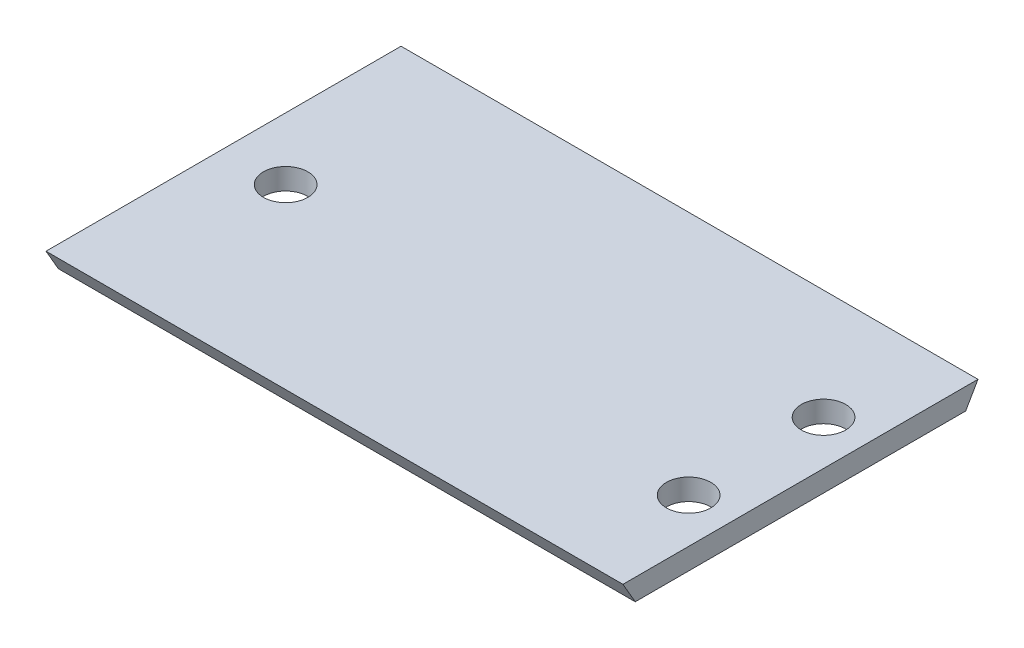
ISO-10303-21;
HEADER;
FILE_DESCRIPTION(('STEP AP214'),'2;1');
FILE_NAME('part.step','',(''),(''),'','','');
FILE_SCHEMA(('AUTOMOTIVE_DESIGN { 1 0 10303 214 1 1 1 1 }'));
ENDSEC;
DATA;
#1=APPLICATION_CONTEXT('core data for automotive mechanical design processes');
#2=APPLICATION_PROTOCOL_DEFINITION('international standard','automotive_design',2000,#1);
#3=PRODUCT_CONTEXT('',#1,'mechanical');
#4=PRODUCT('Part','Part','',(#3));
#5=PRODUCT_RELATED_PRODUCT_CATEGORY('part','',(#4));
#6=PRODUCT_DEFINITION_FORMATION('','',#4);
#7=PRODUCT_DEFINITION_CONTEXT('part definition',#1,'design');
#8=PRODUCT_DEFINITION('design','',#6,#7);
#9=PRODUCT_DEFINITION_SHAPE('','',#8);
#10=(LENGTH_UNIT() NAMED_UNIT(*) SI_UNIT(.MILLI.,.METRE.));
#11=(NAMED_UNIT(*) PLANE_ANGLE_UNIT() SI_UNIT($,.RADIAN.));
#12=(NAMED_UNIT(*) SI_UNIT($,.STERADIAN.) SOLID_ANGLE_UNIT());
#13=UNCERTAINTY_MEASURE_WITH_UNIT(LENGTH_MEASURE(1.E-05),#10,'distance_accuracy_value','');
#14=(GEOMETRIC_REPRESENTATION_CONTEXT(3) GLOBAL_UNCERTAINTY_ASSIGNED_CONTEXT((#13)) GLOBAL_UNIT_ASSIGNED_CONTEXT((#10,
#11,#12)) REPRESENTATION_CONTEXT('',''));
#15=CARTESIAN_POINT('',(0.,0.,0.));
#16=DIRECTION('',(0.,0.,1.));
#17=DIRECTION('',(1.,0.,0.));
#18=AXIS2_PLACEMENT_3D('',#15,#16,#17);
#19=CARTESIAN_POINT('',(0.,-1.2,0.));
#20=DIRECTION('',(-1.,0.,0.));
#21=DIRECTION('',(0.,0.,1.));
#22=AXIS2_PLACEMENT_3D('',#19,#20,#21);
#23=PLANE('',#22);
#24=DIRECTION('',(0.,0.,1.));
#25=VECTOR('',#24,1.);
#26=CARTESIAN_POINT('',(0.,-1.2,0.));
#27=LINE('',#26,#25);
#28=CARTESIAN_POINT('',(0.,-1.2,-19.3071796769724));
#29=VERTEX_POINT('',#28);
#30=CARTESIAN_POINT('',(0.,-1.2,-0.692820323027553));
#31=VERTEX_POINT('',#30);
#32=EDGE_CURVE('E80',#29,#31,#27,.T.);
#33=ORIENTED_EDGE('',*,*,#32,.T.);
#34=DIRECTION('',(0.,0.866025403784439,0.499999999999999));
#35=VECTOR('',#34,1.);
#36=CARTESIAN_POINT('',(0.,-0.899999999999999,-0.519615242270665));
#37=LINE('',#36,#35);
#38=CARTESIAN_POINT('',(0.,0.,0.));
#39=VERTEX_POINT('',#38);
#40=EDGE_CURVE('E11',#31,#39,#37,.T.);
#41=ORIENTED_EDGE('',*,*,#40,.T.);
#42=DIRECTION('',(0.,0.,1.));
#43=VECTOR('',#42,1.);
#44=CARTESIAN_POINT('',(0.,0.,0.));
#45=LINE('',#44,#43);
#46=CARTESIAN_POINT('',(0.,0.,-20.));
#47=VERTEX_POINT('',#46);
#48=EDGE_CURVE('E78',#47,#39,#45,.T.);
#49=ORIENTED_EDGE('',*,*,#48,.F.);
#50=DIRECTION('',(0.,-0.866025403784439,0.499999999999999));
#51=VECTOR('',#50,1.);
#52=CARTESIAN_POINT('',(0.,-9.56025403784437,-14.4803847577293));
#53=LINE('',#52,#51);
#54=EDGE_CURVE('E107',#47,#29,#53,.T.);
#55=ORIENTED_EDGE('',*,*,#54,.T.);
#56=EDGE_LOOP('',(#33,#41,#49,#55));
#57=FACE_BOUND('',#56,.T.);
#58=ADVANCED_FACE('F37',(#57),#23,.T.);
#59=CARTESIAN_POINT('',(32.5,-1.2,0.));
#60=DIRECTION('',(1.,0.,0.));
#61=DIRECTION('',(0.,0.,-1.));
#62=AXIS2_PLACEMENT_3D('',#59,#60,#61);
#63=PLANE('',#62);
#64=DIRECTION('',(0.,0.,-1.));
#65=VECTOR('',#64,1.);
#66=CARTESIAN_POINT('',(32.5,0.,0.));
#67=LINE('',#66,#65);
#68=CARTESIAN_POINT('',(32.5,0.,0.));
#69=VERTEX_POINT('',#68);
#70=CARTESIAN_POINT('',(32.5,0.,-20.));
#71=VERTEX_POINT('',#70);
#72=EDGE_CURVE('E92',#69,#71,#67,.T.);
#73=ORIENTED_EDGE('',*,*,#72,.F.);
#74=DIRECTION('',(0.,-0.866025403784439,-0.499999999999999));
#75=VECTOR('',#74,1.);
#76=CARTESIAN_POINT('',(32.5,-0.900000000000004,-0.519615242270668));
#77=LINE('',#76,#75);
#78=CARTESIAN_POINT('',(32.5,-1.2,-0.692820323027553));
#79=VERTEX_POINT('',#78);
#80=EDGE_CURVE('E59',#69,#79,#77,.T.);
#81=ORIENTED_EDGE('',*,*,#80,.T.);
#82=DIRECTION('',(0.,0.,-1.));
#83=VECTOR('',#82,1.);
#84=CARTESIAN_POINT('',(32.5,-1.2,0.));
#85=LINE('',#84,#83);
#86=CARTESIAN_POINT('',(32.5,-1.2,-19.3071796769724));
#87=VERTEX_POINT('',#86);
#88=EDGE_CURVE('E117',#79,#87,#85,.T.);
#89=ORIENTED_EDGE('',*,*,#88,.T.);
#90=DIRECTION('',(0.,0.866025403784439,-0.499999999999999));
#91=VECTOR('',#90,1.);
#92=CARTESIAN_POINT('',(32.5,-9.56025403784437,-14.4803847577294));
#93=LINE('',#92,#91);
#94=EDGE_CURVE('E113',#87,#71,#93,.T.);
#95=ORIENTED_EDGE('',*,*,#94,.T.);
#96=EDGE_LOOP('',(#73,#81,#89,#95));
#97=FACE_BOUND('',#96,.T.);
#98=ADVANCED_FACE('F116',(#97),#63,.T.);
#99=CARTESIAN_POINT('',(30.,-1.2,-13.8));
#100=DIRECTION('',(0.,1.,0.));
#101=DIRECTION('',(0.,0.,1.));
#102=AXIS2_PLACEMENT_3D('',#99,#100,#101);
#103=CYLINDRICAL_SURFACE('',#102,1.25);
#104=CARTESIAN_POINT('',(30.,-1.2,-13.8));
#105=DIRECTION('',(0.,1.,0.));
#106=DIRECTION('',(0.,0.,1.));
#107=AXIS2_PLACEMENT_3D('',#104,#105,#106);
#108=CIRCLE('',#107,1.25);
#109=CARTESIAN_POINT('',(30.,-1.2,-12.55));
#110=VERTEX_POINT('',#109);
#111=EDGE_CURVE('E129',#110,#110,#108,.T.);
#112=ORIENTED_EDGE('',*,*,#111,.F.);
#113=EDGE_LOOP('',(#112));
#114=FACE_BOUND('',#113,.T.);
#115=CARTESIAN_POINT('',(30.,0.,-13.8));
#116=DIRECTION('',(0.,1.,0.));
#117=DIRECTION('',(0.,0.,1.));
#118=AXIS2_PLACEMENT_3D('',#115,#116,#117);
#119=CIRCLE('',#118,1.25);
#120=CARTESIAN_POINT('',(30.,0.,-12.55));
#121=VERTEX_POINT('',#120);
#122=EDGE_CURVE('E101',#121,#121,#119,.T.);
#123=ORIENTED_EDGE('',*,*,#122,.T.);
#124=EDGE_LOOP('',(#123));
#125=FACE_BOUND('',#124,.T.);
#126=ADVANCED_FACE('F154',(#114,#125),#103,.F.);
#127=CARTESIAN_POINT('',(30.,-1.2,-6.2));
#128=DIRECTION('',(0.,1.,0.));
#129=DIRECTION('',(0.,0.,1.));
#130=AXIS2_PLACEMENT_3D('',#127,#128,#129);
#131=CYLINDRICAL_SURFACE('',#130,1.25);
#132=CARTESIAN_POINT('',(30.,-1.2,-6.2));
#133=DIRECTION('',(0.,1.,0.));
#134=DIRECTION('',(0.,0.,1.));
#135=AXIS2_PLACEMENT_3D('',#132,#133,#134);
#136=CIRCLE('',#135,1.25);
#137=CARTESIAN_POINT('',(30.,-1.2,-4.95));
#138=VERTEX_POINT('',#137);
#139=EDGE_CURVE('E124',#138,#138,#136,.T.);
#140=ORIENTED_EDGE('',*,*,#139,.F.);
#141=EDGE_LOOP('',(#140));
#142=FACE_BOUND('',#141,.T.);
#143=CARTESIAN_POINT('',(30.,0.,-6.2));
#144=DIRECTION('',(0.,1.,0.));
#145=DIRECTION('',(0.,0.,1.));
#146=AXIS2_PLACEMENT_3D('',#143,#144,#145);
#147=CIRCLE('',#146,1.25);
#148=CARTESIAN_POINT('',(30.,0.,-4.95));
#149=VERTEX_POINT('',#148);
#150=EDGE_CURVE('E98',#149,#149,#147,.T.);
#151=ORIENTED_EDGE('',*,*,#150,.T.);
#152=EDGE_LOOP('',(#151));
#153=FACE_BOUND('',#152,.T.);
#154=ADVANCED_FACE('F138',(#142,#153),#131,.F.);
#155=CARTESIAN_POINT('',(3.5,-1.2,-10.));
#156=DIRECTION('',(0.,1.,0.));
#157=DIRECTION('',(0.,0.,1.));
#158=AXIS2_PLACEMENT_3D('',#155,#156,#157);
#159=CYLINDRICAL_SURFACE('',#158,1.25);
#160=CARTESIAN_POINT('',(3.5,-1.2,-10.));
#161=DIRECTION('',(0.,1.,0.));
#162=DIRECTION('',(0.,0.,1.));
#163=AXIS2_PLACEMENT_3D('',#160,#161,#162);
#164=CIRCLE('',#163,1.25);
#165=CARTESIAN_POINT('',(3.5,-1.2,-8.75));
#166=VERTEX_POINT('',#165);
#167=EDGE_CURVE('E110',#166,#166,#164,.T.);
#168=ORIENTED_EDGE('',*,*,#167,.F.);
#169=EDGE_LOOP('',(#168));
#170=FACE_BOUND('',#169,.T.);
#171=CARTESIAN_POINT('',(3.5,0.,-10.));
#172=DIRECTION('',(0.,1.,0.));
#173=DIRECTION('',(0.,0.,1.));
#174=AXIS2_PLACEMENT_3D('',#171,#172,#173);
#175=CIRCLE('',#174,1.25);
#176=CARTESIAN_POINT('',(3.5,0.,-8.75));
#177=VERTEX_POINT('',#176);
#178=EDGE_CURVE('E104',#177,#177,#175,.T.);
#179=ORIENTED_EDGE('',*,*,#178,.T.);
#180=EDGE_LOOP('',(#179));
#181=FACE_BOUND('',#180,.T.);
#182=ADVANCED_FACE('F135',(#170,#181),#159,.F.);
#183=CARTESIAN_POINT('',(0.,-1.2,0.));
#184=DIRECTION('',(0.,1.,0.));
#185=DIRECTION('',(0.,0.,1.));
#186=AXIS2_PLACEMENT_3D('',#183,#184,#185);
#187=PLANE('',#186);
#188=ORIENTED_EDGE('',*,*,#88,.F.);
#189=DIRECTION('',(-1.,0.,0.));
#190=VECTOR('',#189,1.);
#191=CARTESIAN_POINT('',(0.,-1.2,-0.692820323027553));
#192=LINE('',#191,#190);
#193=EDGE_CURVE('E45',#79,#31,#192,.T.);
#194=ORIENTED_EDGE('',*,*,#193,.T.);
#195=ORIENTED_EDGE('',*,*,#32,.F.);
#196=DIRECTION('',(1.,0.,0.));
#197=VECTOR('',#196,1.);
#198=CARTESIAN_POINT('',(32.5,-1.2,-19.3071796769724));
#199=LINE('',#198,#197);
#200=EDGE_CURVE('E109',#29,#87,#199,.T.);
#201=ORIENTED_EDGE('',*,*,#200,.T.);
#202=EDGE_LOOP('',(#188,#194,#195,#201));
#203=FACE_BOUND('',#202,.T.);
#204=ORIENTED_EDGE('',*,*,#139,.T.);
#205=EDGE_LOOP('',(#204));
#206=FACE_BOUND('',#205,.T.);
#207=ORIENTED_EDGE('',*,*,#111,.T.);
#208=EDGE_LOOP('',(#207));
#209=FACE_BOUND('',#208,.T.);
#210=ORIENTED_EDGE('',*,*,#167,.T.);
#211=EDGE_LOOP('',(#210));
#212=FACE_BOUND('',#211,.T.);
#213=ADVANCED_FACE('F121',(#203,#206,#209,#212),#187,.F.);
#214=CARTESIAN_POINT('',(0.,0.,0.));
#215=DIRECTION('',(0.,1.,0.));
#216=DIRECTION('',(0.,0.,1.));
#217=AXIS2_PLACEMENT_3D('',#214,#215,#216);
#218=PLANE('',#217);
#219=ORIENTED_EDGE('',*,*,#48,.T.);
#220=DIRECTION('',(1.,0.,0.));
#221=VECTOR('',#220,1.);
#222=CARTESIAN_POINT('',(0.,0.,0.));
#223=LINE('',#222,#221);
#224=EDGE_CURVE('E88',#39,#69,#223,.T.);
#225=ORIENTED_EDGE('',*,*,#224,.T.);
#226=ORIENTED_EDGE('',*,*,#72,.T.);
#227=DIRECTION('',(-1.,0.,0.));
#228=VECTOR('',#227,1.);
#229=CARTESIAN_POINT('',(0.,0.,-20.));
#230=LINE('',#229,#228);
#231=EDGE_CURVE('E90',#71,#47,#230,.T.);
#232=ORIENTED_EDGE('',*,*,#231,.T.);
#233=EDGE_LOOP('',(#219,#225,#226,#232));
#234=FACE_BOUND('',#233,.T.);
#235=ORIENTED_EDGE('',*,*,#150,.F.);
#236=EDGE_LOOP('',(#235));
#237=FACE_BOUND('',#236,.T.);
#238=ORIENTED_EDGE('',*,*,#122,.F.);
#239=EDGE_LOOP('',(#238));
#240=FACE_BOUND('',#239,.T.);
#241=ORIENTED_EDGE('',*,*,#178,.F.);
#242=EDGE_LOOP('',(#241));
#243=FACE_BOUND('',#242,.T.);
#244=ADVANCED_FACE('F85',(#234,#237,#240,#243),#218,.T.);
#245=CARTESIAN_POINT('',(0.,0.,-20.));
#246=DIRECTION('',(0.,-0.499999999999999,-0.866025403784439));
#247=DIRECTION('',(1.,0.,0.));
#248=AXIS2_PLACEMENT_3D('',#245,#246,#247);
#249=PLANE('',#248);
#250=ORIENTED_EDGE('',*,*,#94,.F.);
#251=ORIENTED_EDGE('',*,*,#200,.F.);
#252=ORIENTED_EDGE('',*,*,#54,.F.);
#253=ORIENTED_EDGE('',*,*,#231,.F.);
#254=EDGE_LOOP('',(#250,#251,#252,#253));
#255=FACE_BOUND('',#254,.T.);
#256=ADVANCED_FACE('F120',(#255),#249,.T.);
#257=CARTESIAN_POINT('',(0.,0.,0.));
#258=DIRECTION('',(0.,-0.499999999999999,0.866025403784439));
#259=DIRECTION('',(-1.,0.,0.));
#260=AXIS2_PLACEMENT_3D('',#257,#258,#259);
#261=PLANE('',#260);
#262=ORIENTED_EDGE('',*,*,#40,.F.);
#263=ORIENTED_EDGE('',*,*,#193,.F.);
#264=ORIENTED_EDGE('',*,*,#80,.F.);
#265=ORIENTED_EDGE('',*,*,#224,.F.);
#266=EDGE_LOOP('',(#262,#263,#264,#265));
#267=FACE_BOUND('',#266,.T.);
#268=ADVANCED_FACE('F39',(#267),#261,.T.);
#269=CLOSED_SHELL('',(#58,#98,#126,#154,#182,#213,#244,#256,#268));
#270=MANIFOLD_SOLID_BREP('B2',#269);
#271=ADVANCED_BREP_SHAPE_REPRESENTATION('',(#18,#270),#14);
#272=SHAPE_DEFINITION_REPRESENTATION(#9,#271);
ENDSEC;
END-ISO-10303-21;
